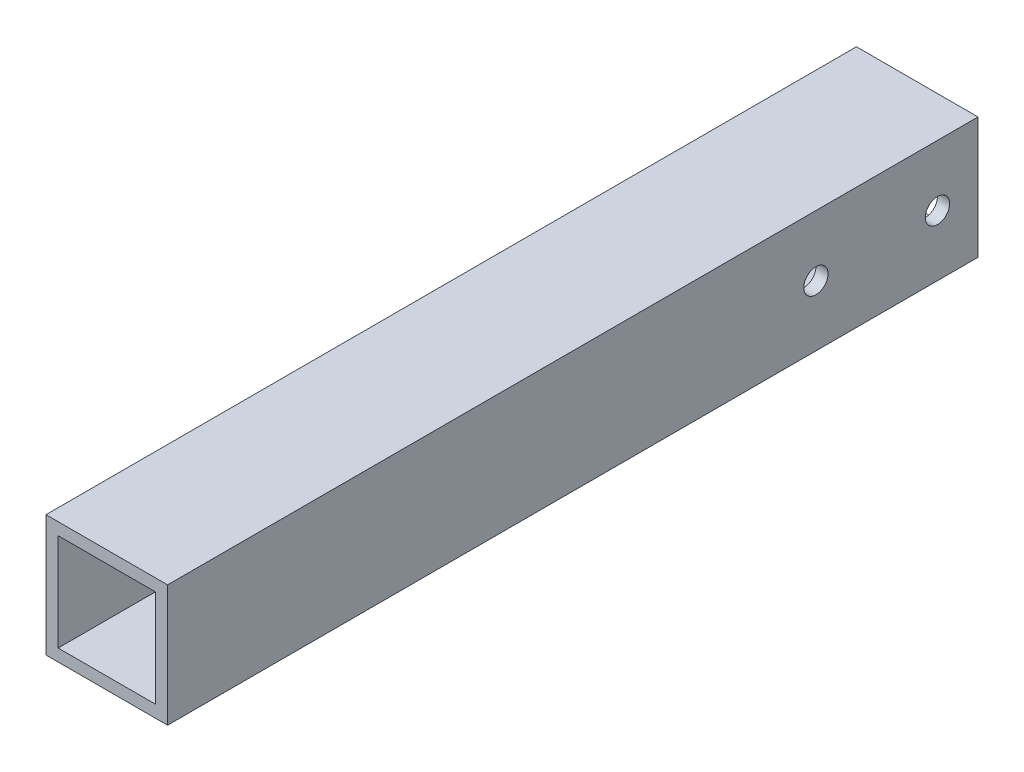
ISO-10303-21;
HEADER;
FILE_DESCRIPTION(('STEP AP214'),'2;1');
FILE_NAME('part.step','',(''),(''),'','','');
FILE_SCHEMA(('AUTOMOTIVE_DESIGN { 1 0 10303 214 1 1 1 1 }'));
ENDSEC;
DATA;
#1=APPLICATION_CONTEXT('core data for automotive mechanical design processes');
#2=APPLICATION_PROTOCOL_DEFINITION('international standard','automotive_design',2000,#1);
#3=PRODUCT_CONTEXT('',#1,'mechanical');
#4=PRODUCT('Part','Part','',(#3));
#5=PRODUCT_RELATED_PRODUCT_CATEGORY('part','',(#4));
#6=PRODUCT_DEFINITION_FORMATION('','',#4);
#7=PRODUCT_DEFINITION_CONTEXT('part definition',#1,'design');
#8=PRODUCT_DEFINITION('design','',#6,#7);
#9=PRODUCT_DEFINITION_SHAPE('','',#8);
#10=(LENGTH_UNIT() NAMED_UNIT(*) SI_UNIT(.MILLI.,.METRE.));
#11=(NAMED_UNIT(*) PLANE_ANGLE_UNIT() SI_UNIT($,.RADIAN.));
#12=(NAMED_UNIT(*) SI_UNIT($,.STERADIAN.) SOLID_ANGLE_UNIT());
#13=UNCERTAINTY_MEASURE_WITH_UNIT(LENGTH_MEASURE(1.E-05),#10,'distance_accuracy_value','');
#14=(GEOMETRIC_REPRESENTATION_CONTEXT(3) GLOBAL_UNCERTAINTY_ASSIGNED_CONTEXT((#13)) GLOBAL_UNIT_ASSIGNED_CONTEXT((#10,
#11,#12)) REPRESENTATION_CONTEXT('',''));
#15=CARTESIAN_POINT('',(0.,0.,0.));
#16=DIRECTION('',(0.,0.,1.));
#17=DIRECTION('',(1.,0.,0.));
#18=AXIS2_PLACEMENT_3D('',#15,#16,#17);
#19=CARTESIAN_POINT('',(7.5,-7.49999999999999,100.));
#20=DIRECTION('',(-1.,0.,0.));
#21=DIRECTION('',(0.,0.,1.));
#22=AXIS2_PLACEMENT_3D('',#19,#20,#21);
#23=PLANE('',#22);
#24=CARTESIAN_POINT('',(7.5,0.,20.));
#25=DIRECTION('',(1.,0.,0.));
#26=DIRECTION('',(0.,0.,-1.));
#27=AXIS2_PLACEMENT_3D('',#24,#25,#26);
#28=CIRCLE('',#27,1.5);
#29=CARTESIAN_POINT('',(7.5,0.,18.5));
#30=VERTEX_POINT('',#29);
#31=EDGE_CURVE('E176',#30,#30,#28,.T.);
#32=ORIENTED_EDGE('',*,*,#31,.F.);
#33=EDGE_LOOP('',(#32));
#34=FACE_BOUND('',#33,.T.);
#35=CARTESIAN_POINT('',(7.5,0.,5.00000000000001));
#36=DIRECTION('',(1.,0.,0.));
#37=DIRECTION('',(0.,0.,-1.));
#38=AXIS2_PLACEMENT_3D('',#35,#36,#37);
#39=CIRCLE('',#38,1.5);
#40=CARTESIAN_POINT('',(7.5,0.,3.50000000000001));
#41=VERTEX_POINT('',#40);
#42=EDGE_CURVE('E167',#41,#41,#39,.T.);
#43=ORIENTED_EDGE('',*,*,#42,.F.);
#44=EDGE_LOOP('',(#43));
#45=FACE_BOUND('',#44,.T.);
#46=DIRECTION('',(0.,1.,0.));
#47=VECTOR('',#46,1.);
#48=CARTESIAN_POINT('',(7.5,-7.49999999999999,0.));
#49=LINE('',#48,#47);
#50=CARTESIAN_POINT('',(7.5,-7.49999999999999,0.));
#51=VERTEX_POINT('',#50);
#52=CARTESIAN_POINT('',(7.5,7.50000000000001,0.));
#53=VERTEX_POINT('',#52);
#54=EDGE_CURVE('E132',#51,#53,#49,.T.);
#55=ORIENTED_EDGE('',*,*,#54,.T.);
#56=DIRECTION('',(0.,0.,-1.));
#57=VECTOR('',#56,1.);
#58=CARTESIAN_POINT('',(7.5,7.50000000000001,100.));
#59=LINE('',#58,#57);
#60=CARTESIAN_POINT('',(7.5,7.50000000000001,100.));
#61=VERTEX_POINT('',#60);
#62=EDGE_CURVE('E11',#61,#53,#59,.T.);
#63=ORIENTED_EDGE('',*,*,#62,.F.);
#64=DIRECTION('',(0.,1.,0.));
#65=VECTOR('',#64,1.);
#66=CARTESIAN_POINT('',(7.5,-7.49999999999999,100.));
#67=LINE('',#66,#65);
#68=CARTESIAN_POINT('',(7.5,-7.49999999999999,100.));
#69=VERTEX_POINT('',#68);
#70=EDGE_CURVE('E136',#69,#61,#67,.T.);
#71=ORIENTED_EDGE('',*,*,#70,.F.);
#72=DIRECTION('',(0.,0.,-1.));
#73=VECTOR('',#72,1.);
#74=CARTESIAN_POINT('',(7.5,-7.49999999999999,100.));
#75=LINE('',#74,#73);
#76=EDGE_CURVE('E146',#69,#51,#75,.T.);
#77=ORIENTED_EDGE('',*,*,#76,.T.);
#78=EDGE_LOOP('',(#55,#63,#71,#77));
#79=FACE_BOUND('',#78,.T.);
#80=ADVANCED_FACE('F30',(#34,#45,#79),#23,.F.);
#81=CARTESIAN_POINT('',(-7.5,7.50000000000001,100.));
#82=DIRECTION('',(0.,-1.,0.));
#83=DIRECTION('',(0.,0.,-1.));
#84=AXIS2_PLACEMENT_3D('',#81,#82,#83);
#85=PLANE('',#84);
#86=DIRECTION('',(-1.,0.,0.));
#87=VECTOR('',#86,1.);
#88=CARTESIAN_POINT('',(-7.5,7.50000000000001,0.));
#89=LINE('',#88,#87);
#90=CARTESIAN_POINT('',(-7.5,7.50000000000001,0.));
#91=VERTEX_POINT('',#90);
#92=EDGE_CURVE('E149',#53,#91,#89,.T.);
#93=ORIENTED_EDGE('',*,*,#92,.T.);
#94=DIRECTION('',(0.,0.,-1.));
#95=VECTOR('',#94,1.);
#96=CARTESIAN_POINT('',(-7.5,7.50000000000001,100.));
#97=LINE('',#96,#95);
#98=CARTESIAN_POINT('',(-7.5,7.50000000000001,100.));
#99=VERTEX_POINT('',#98);
#100=EDGE_CURVE('E38',#99,#91,#97,.T.);
#101=ORIENTED_EDGE('',*,*,#100,.F.);
#102=DIRECTION('',(-1.,0.,0.));
#103=VECTOR('',#102,1.);
#104=CARTESIAN_POINT('',(-7.5,7.50000000000001,100.));
#105=LINE('',#104,#103);
#106=EDGE_CURVE('E139',#61,#99,#105,.T.);
#107=ORIENTED_EDGE('',*,*,#106,.F.);
#108=ORIENTED_EDGE('',*,*,#62,.T.);
#109=EDGE_LOOP('',(#93,#101,#107,#108));
#110=FACE_BOUND('',#109,.T.);
#111=ADVANCED_FACE('F203',(#110),#85,.F.);
#112=CARTESIAN_POINT('',(-7.5,-7.49999999999999,100.));
#113=DIRECTION('',(1.,0.,0.));
#114=DIRECTION('',(0.,0.,-1.));
#115=AXIS2_PLACEMENT_3D('',#112,#113,#114);
#116=PLANE('',#115);
#117=CARTESIAN_POINT('',(-7.5,0.,20.));
#118=DIRECTION('',(1.,0.,0.));
#119=DIRECTION('',(0.,0.,-1.));
#120=AXIS2_PLACEMENT_3D('',#117,#118,#119);
#121=CIRCLE('',#120,1.5);
#122=CARTESIAN_POINT('',(-7.5,0.,18.5));
#123=VERTEX_POINT('',#122);
#124=EDGE_CURVE('E179',#123,#123,#121,.T.);
#125=ORIENTED_EDGE('',*,*,#124,.T.);
#126=EDGE_LOOP('',(#125));
#127=FACE_BOUND('',#126,.T.);
#128=CARTESIAN_POINT('',(-7.5,0.,5.00000000000001));
#129=DIRECTION('',(1.,0.,0.));
#130=DIRECTION('',(0.,0.,-1.));
#131=AXIS2_PLACEMENT_3D('',#128,#129,#130);
#132=CIRCLE('',#131,1.5);
#133=CARTESIAN_POINT('',(-7.5,0.,3.50000000000001));
#134=VERTEX_POINT('',#133);
#135=EDGE_CURVE('E162',#134,#134,#132,.T.);
#136=ORIENTED_EDGE('',*,*,#135,.T.);
#137=EDGE_LOOP('',(#136));
#138=FACE_BOUND('',#137,.T.);
#139=DIRECTION('',(0.,-1.,0.));
#140=VECTOR('',#139,1.);
#141=CARTESIAN_POINT('',(-7.5,-7.49999999999999,0.));
#142=LINE('',#141,#140);
#143=CARTESIAN_POINT('',(-7.5,-7.49999999999999,0.));
#144=VERTEX_POINT('',#143);
#145=EDGE_CURVE('E151',#91,#144,#142,.T.);
#146=ORIENTED_EDGE('',*,*,#145,.T.);
#147=DIRECTION('',(0.,0.,-1.));
#148=VECTOR('',#147,1.);
#149=CARTESIAN_POINT('',(-7.5,-7.49999999999999,100.));
#150=LINE('',#149,#148);
#151=CARTESIAN_POINT('',(-7.5,-7.49999999999999,100.));
#152=VERTEX_POINT('',#151);
#153=EDGE_CURVE('E156',#152,#144,#150,.T.);
#154=ORIENTED_EDGE('',*,*,#153,.F.);
#155=DIRECTION('',(0.,-1.,0.));
#156=VECTOR('',#155,1.);
#157=CARTESIAN_POINT('',(-7.5,-7.49999999999999,100.));
#158=LINE('',#157,#156);
#159=EDGE_CURVE('E142',#99,#152,#158,.T.);
#160=ORIENTED_EDGE('',*,*,#159,.F.);
#161=ORIENTED_EDGE('',*,*,#100,.T.);
#162=EDGE_LOOP('',(#146,#154,#160,#161));
#163=FACE_BOUND('',#162,.T.);
#164=ADVANCED_FACE('F208',(#127,#138,#163),#116,.F.);
#165=CARTESIAN_POINT('',(-7.5,-7.49999999999999,100.));
#166=DIRECTION('',(0.,1.,0.));
#167=DIRECTION('',(0.,0.,1.));
#168=AXIS2_PLACEMENT_3D('',#165,#166,#167);
#169=PLANE('',#168);
#170=DIRECTION('',(1.,0.,0.));
#171=VECTOR('',#170,1.);
#172=CARTESIAN_POINT('',(-7.5,-7.49999999999999,0.));
#173=LINE('',#172,#171);
#174=EDGE_CURVE('E140',#144,#51,#173,.T.);
#175=ORIENTED_EDGE('',*,*,#174,.T.);
#176=ORIENTED_EDGE('',*,*,#76,.F.);
#177=DIRECTION('',(1.,0.,0.));
#178=VECTOR('',#177,1.);
#179=CARTESIAN_POINT('',(-7.5,-7.49999999999999,100.));
#180=LINE('',#179,#178);
#181=EDGE_CURVE('E144',#152,#69,#180,.T.);
#182=ORIENTED_EDGE('',*,*,#181,.F.);
#183=ORIENTED_EDGE('',*,*,#153,.T.);
#184=EDGE_LOOP('',(#175,#176,#182,#183));
#185=FACE_BOUND('',#184,.T.);
#186=ADVANCED_FACE('F227',(#185),#169,.F.);
#187=CARTESIAN_POINT('',(7.5,7.50000000000001,100.));
#188=DIRECTION('',(0.,0.,-1.));
#189=DIRECTION('',(-1.,0.,0.));
#190=AXIS2_PLACEMENT_3D('',#187,#188,#189);
#191=PLANE('',#190);
#192=DIRECTION('',(-1.,0.,0.));
#193=VECTOR('',#192,1.);
#194=CARTESIAN_POINT('',(-6.,6.00000000000001,100.));
#195=LINE('',#194,#193);
#196=CARTESIAN_POINT('',(6.,6.00000000000001,100.));
#197=VERTEX_POINT('',#196);
#198=CARTESIAN_POINT('',(-6.,6.00000000000001,100.));
#199=VERTEX_POINT('',#198);
#200=EDGE_CURVE('E126',#197,#199,#195,.T.);
#201=ORIENTED_EDGE('',*,*,#200,.F.);
#202=DIRECTION('',(0.,1.,0.));
#203=VECTOR('',#202,1.);
#204=CARTESIAN_POINT('',(6.,-6.00000000000001,100.));
#205=LINE('',#204,#203);
#206=CARTESIAN_POINT('',(6.,-6.00000000000001,100.));
#207=VERTEX_POINT('',#206);
#208=EDGE_CURVE('E46',#207,#197,#205,.T.);
#209=ORIENTED_EDGE('',*,*,#208,.F.);
#210=DIRECTION('',(1.,0.,0.));
#211=VECTOR('',#210,1.);
#212=CARTESIAN_POINT('',(-6.,-6.00000000000001,100.));
#213=LINE('',#212,#211);
#214=CARTESIAN_POINT('',(-6.,-6.00000000000001,100.));
#215=VERTEX_POINT('',#214);
#216=EDGE_CURVE('E114',#215,#207,#213,.T.);
#217=ORIENTED_EDGE('',*,*,#216,.F.);
#218=DIRECTION('',(0.,-1.,0.));
#219=VECTOR('',#218,1.);
#220=CARTESIAN_POINT('',(-6.,-6.00000000000001,100.));
#221=LINE('',#220,#219);
#222=EDGE_CURVE('E117',#199,#215,#221,.T.);
#223=ORIENTED_EDGE('',*,*,#222,.F.);
#224=EDGE_LOOP('',(#201,#209,#217,#223));
#225=FACE_BOUND('',#224,.T.);
#226=ORIENTED_EDGE('',*,*,#70,.T.);
#227=ORIENTED_EDGE('',*,*,#106,.T.);
#228=ORIENTED_EDGE('',*,*,#159,.T.);
#229=ORIENTED_EDGE('',*,*,#181,.T.);
#230=EDGE_LOOP('',(#226,#227,#228,#229));
#231=FACE_BOUND('',#230,.T.);
#232=ADVANCED_FACE('F223',(#225,#231),#191,.F.);
#233=CARTESIAN_POINT('',(7.5,7.50000000000001,0.));
#234=DIRECTION('',(0.,0.,-1.));
#235=DIRECTION('',(-1.,0.,0.));
#236=AXIS2_PLACEMENT_3D('',#233,#234,#235);
#237=PLANE('',#236);
#238=DIRECTION('',(0.,1.,0.));
#239=VECTOR('',#238,1.);
#240=CARTESIAN_POINT('',(6.,-6.00000000000001,0.));
#241=LINE('',#240,#239);
#242=CARTESIAN_POINT('',(6.,-6.00000000000001,0.));
#243=VERTEX_POINT('',#242);
#244=CARTESIAN_POINT('',(6.,6.00000000000001,0.));
#245=VERTEX_POINT('',#244);
#246=EDGE_CURVE('E98',#243,#245,#241,.T.);
#247=ORIENTED_EDGE('',*,*,#246,.T.);
#248=DIRECTION('',(-1.,0.,0.));
#249=VECTOR('',#248,1.);
#250=CARTESIAN_POINT('',(-6.,6.00000000000001,0.));
#251=LINE('',#250,#249);
#252=CARTESIAN_POINT('',(-6.,6.00000000000001,0.));
#253=VERTEX_POINT('',#252);
#254=EDGE_CURVE('E107',#245,#253,#251,.T.);
#255=ORIENTED_EDGE('',*,*,#254,.T.);
#256=DIRECTION('',(0.,-1.,0.));
#257=VECTOR('',#256,1.);
#258=CARTESIAN_POINT('',(-6.,-6.00000000000001,0.));
#259=LINE('',#258,#257);
#260=CARTESIAN_POINT('',(-6.,-6.00000000000001,0.));
#261=VERTEX_POINT('',#260);
#262=EDGE_CURVE('E54',#253,#261,#259,.T.);
#263=ORIENTED_EDGE('',*,*,#262,.T.);
#264=DIRECTION('',(1.,0.,0.));
#265=VECTOR('',#264,1.);
#266=CARTESIAN_POINT('',(-6.,-6.00000000000001,0.));
#267=LINE('',#266,#265);
#268=EDGE_CURVE('E104',#261,#243,#267,.T.);
#269=ORIENTED_EDGE('',*,*,#268,.T.);
#270=EDGE_LOOP('',(#247,#255,#263,#269));
#271=FACE_BOUND('',#270,.T.);
#272=ORIENTED_EDGE('',*,*,#54,.F.);
#273=ORIENTED_EDGE('',*,*,#174,.F.);
#274=ORIENTED_EDGE('',*,*,#145,.F.);
#275=ORIENTED_EDGE('',*,*,#92,.F.);
#276=EDGE_LOOP('',(#272,#273,#274,#275));
#277=FACE_BOUND('',#276,.T.);
#278=ADVANCED_FACE('F111',(#271,#277),#237,.T.);
#279=CARTESIAN_POINT('',(6.,-6.00000000000001,0.));
#280=DIRECTION('',(1.,0.,0.));
#281=DIRECTION('',(0.,0.,-1.));
#282=AXIS2_PLACEMENT_3D('',#279,#280,#281);
#283=PLANE('',#282);
#284=CARTESIAN_POINT('',(6.,0.,20.));
#285=DIRECTION('',(1.,0.,0.));
#286=DIRECTION('',(0.,0.,-1.));
#287=AXIS2_PLACEMENT_3D('',#284,#285,#286);
#288=CIRCLE('',#287,1.5);
#289=CARTESIAN_POINT('',(6.,0.,18.5));
#290=VERTEX_POINT('',#289);
#291=EDGE_CURVE('E172',#290,#290,#288,.T.);
#292=ORIENTED_EDGE('',*,*,#291,.T.);
#293=EDGE_LOOP('',(#292));
#294=FACE_BOUND('',#293,.T.);
#295=CARTESIAN_POINT('',(6.,0.,5.00000000000001));
#296=DIRECTION('',(1.,0.,0.));
#297=DIRECTION('',(0.,0.,-1.));
#298=AXIS2_PLACEMENT_3D('',#295,#296,#297);
#299=CIRCLE('',#298,1.5);
#300=CARTESIAN_POINT('',(6.,0.,3.50000000000001));
#301=VERTEX_POINT('',#300);
#302=EDGE_CURVE('E120',#301,#301,#299,.T.);
#303=ORIENTED_EDGE('',*,*,#302,.T.);
#304=EDGE_LOOP('',(#303));
#305=FACE_BOUND('',#304,.T.);
#306=ORIENTED_EDGE('',*,*,#208,.T.);
#307=DIRECTION('',(0.,0.,1.));
#308=VECTOR('',#307,1.);
#309=CARTESIAN_POINT('',(6.,6.00000000000001,0.));
#310=LINE('',#309,#308);
#311=EDGE_CURVE('E94',#245,#197,#310,.T.);
#312=ORIENTED_EDGE('',*,*,#311,.F.);
#313=ORIENTED_EDGE('',*,*,#246,.F.);
#314=DIRECTION('',(0.,0.,1.));
#315=VECTOR('',#314,1.);
#316=CARTESIAN_POINT('',(6.,-6.00000000000001,0.));
#317=LINE('',#316,#315);
#318=EDGE_CURVE('E130',#243,#207,#317,.T.);
#319=ORIENTED_EDGE('',*,*,#318,.T.);
#320=EDGE_LOOP('',(#306,#312,#313,#319));
#321=FACE_BOUND('',#320,.T.);
#322=ADVANCED_FACE('F96',(#294,#305,#321),#283,.F.);
#323=CARTESIAN_POINT('',(-6.,-6.00000000000001,0.));
#324=DIRECTION('',(0.,-1.,0.));
#325=DIRECTION('',(0.,0.,-1.));
#326=AXIS2_PLACEMENT_3D('',#323,#324,#325);
#327=PLANE('',#326);
#328=ORIENTED_EDGE('',*,*,#216,.T.);
#329=ORIENTED_EDGE('',*,*,#318,.F.);
#330=ORIENTED_EDGE('',*,*,#268,.F.);
#331=DIRECTION('',(0.,0.,1.));
#332=VECTOR('',#331,1.);
#333=CARTESIAN_POINT('',(-6.,-6.00000000000001,0.));
#334=LINE('',#333,#332);
#335=EDGE_CURVE('E133',#261,#215,#334,.T.);
#336=ORIENTED_EDGE('',*,*,#335,.T.);
#337=EDGE_LOOP('',(#328,#329,#330,#336));
#338=FACE_BOUND('',#337,.T.);
#339=ADVANCED_FACE('F243',(#338),#327,.F.);
#340=CARTESIAN_POINT('',(-6.,-6.00000000000001,0.));
#341=DIRECTION('',(-1.,0.,0.));
#342=DIRECTION('',(0.,0.,1.));
#343=AXIS2_PLACEMENT_3D('',#340,#341,#342);
#344=PLANE('',#343);
#345=CARTESIAN_POINT('',(-6.,0.,20.));
#346=DIRECTION('',(-1.,0.,0.));
#347=DIRECTION('',(0.,0.,1.));
#348=AXIS2_PLACEMENT_3D('',#345,#346,#347);
#349=CIRCLE('',#348,1.5);
#350=CARTESIAN_POINT('',(-6.,0.,21.5));
#351=VERTEX_POINT('',#350);
#352=EDGE_CURVE('E33',#351,#351,#349,.T.);
#353=ORIENTED_EDGE('',*,*,#352,.T.);
#354=EDGE_LOOP('',(#353));
#355=FACE_BOUND('',#354,.T.);
#356=CARTESIAN_POINT('',(-6.,0.,5.00000000000001));
#357=DIRECTION('',(-1.,0.,0.));
#358=DIRECTION('',(0.,0.,1.));
#359=AXIS2_PLACEMENT_3D('',#356,#357,#358);
#360=CIRCLE('',#359,1.5);
#361=CARTESIAN_POINT('',(-6.,0.,6.50000000000001));
#362=VERTEX_POINT('',#361);
#363=EDGE_CURVE('E160',#362,#362,#360,.T.);
#364=ORIENTED_EDGE('',*,*,#363,.T.);
#365=EDGE_LOOP('',(#364));
#366=FACE_BOUND('',#365,.T.);
#367=ORIENTED_EDGE('',*,*,#222,.T.);
#368=ORIENTED_EDGE('',*,*,#335,.F.);
#369=ORIENTED_EDGE('',*,*,#262,.F.);
#370=DIRECTION('',(0.,0.,1.));
#371=VECTOR('',#370,1.);
#372=CARTESIAN_POINT('',(-6.,6.00000000000001,0.));
#373=LINE('',#372,#371);
#374=EDGE_CURVE('E103',#253,#199,#373,.T.);
#375=ORIENTED_EDGE('',*,*,#374,.T.);
#376=EDGE_LOOP('',(#367,#368,#369,#375));
#377=FACE_BOUND('',#376,.T.);
#378=ADVANCED_FACE('F186',(#355,#366,#377),#344,.F.);
#379=CARTESIAN_POINT('',(-6.,6.00000000000001,0.));
#380=DIRECTION('',(0.,1.,0.));
#381=DIRECTION('',(0.,0.,1.));
#382=AXIS2_PLACEMENT_3D('',#379,#380,#381);
#383=PLANE('',#382);
#384=ORIENTED_EDGE('',*,*,#200,.T.);
#385=ORIENTED_EDGE('',*,*,#374,.F.);
#386=ORIENTED_EDGE('',*,*,#254,.F.);
#387=ORIENTED_EDGE('',*,*,#311,.T.);
#388=EDGE_LOOP('',(#384,#385,#386,#387));
#389=FACE_BOUND('',#388,.T.);
#390=ADVANCED_FACE('F108',(#389),#383,.F.);
#391=CARTESIAN_POINT('',(-7.5,0.,5.00000000000001));
#392=DIRECTION('',(1.,0.,0.));
#393=DIRECTION('',(0.,0.,-1.));
#394=AXIS2_PLACEMENT_3D('',#391,#392,#393);
#395=CYLINDRICAL_SURFACE('',#394,1.5);
#396=ORIENTED_EDGE('',*,*,#135,.F.);
#397=EDGE_LOOP('',(#396));
#398=FACE_BOUND('',#397,.T.);
#399=ORIENTED_EDGE('',*,*,#363,.F.);
#400=EDGE_LOOP('',(#399));
#401=FACE_BOUND('',#400,.T.);
#402=ADVANCED_FACE('F199',(#398,#401),#395,.F.);
#403=ORIENTED_EDGE('',*,*,#42,.T.);
#404=EDGE_LOOP('',(#403));
#405=FACE_BOUND('',#404,.T.);
#406=ORIENTED_EDGE('',*,*,#302,.F.);
#407=EDGE_LOOP('',(#406));
#408=FACE_BOUND('',#407,.T.);
#409=ADVANCED_FACE('F191',(#405,#408),#395,.F.);
#410=CARTESIAN_POINT('',(-7.5,0.,20.));
#411=DIRECTION('',(1.,0.,0.));
#412=DIRECTION('',(0.,0.,-1.));
#413=AXIS2_PLACEMENT_3D('',#410,#411,#412);
#414=CYLINDRICAL_SURFACE('',#413,1.5);
#415=ORIENTED_EDGE('',*,*,#124,.F.);
#416=EDGE_LOOP('',(#415));
#417=FACE_BOUND('',#416,.T.);
#418=ORIENTED_EDGE('',*,*,#352,.F.);
#419=EDGE_LOOP('',(#418));
#420=FACE_BOUND('',#419,.T.);
#421=ADVANCED_FACE('F188',(#417,#420),#414,.F.);
#422=ORIENTED_EDGE('',*,*,#31,.T.);
#423=EDGE_LOOP('',(#422));
#424=FACE_BOUND('',#423,.T.);
#425=ORIENTED_EDGE('',*,*,#291,.F.);
#426=EDGE_LOOP('',(#425));
#427=FACE_BOUND('',#426,.T.);
#428=ADVANCED_FACE('F190',(#424,#427),#414,.F.);
#429=CLOSED_SHELL('',(#80,#111,#164,#186,#232,#278,#322,#339,#378,#390,#402,#409,#421,#428));
#430=MANIFOLD_SOLID_BREP('B2',#429);
#431=ADVANCED_BREP_SHAPE_REPRESENTATION('',(#18,#430),#14);
#432=SHAPE_DEFINITION_REPRESENTATION(#9,#431);
ENDSEC;
END-ISO-10303-21;
